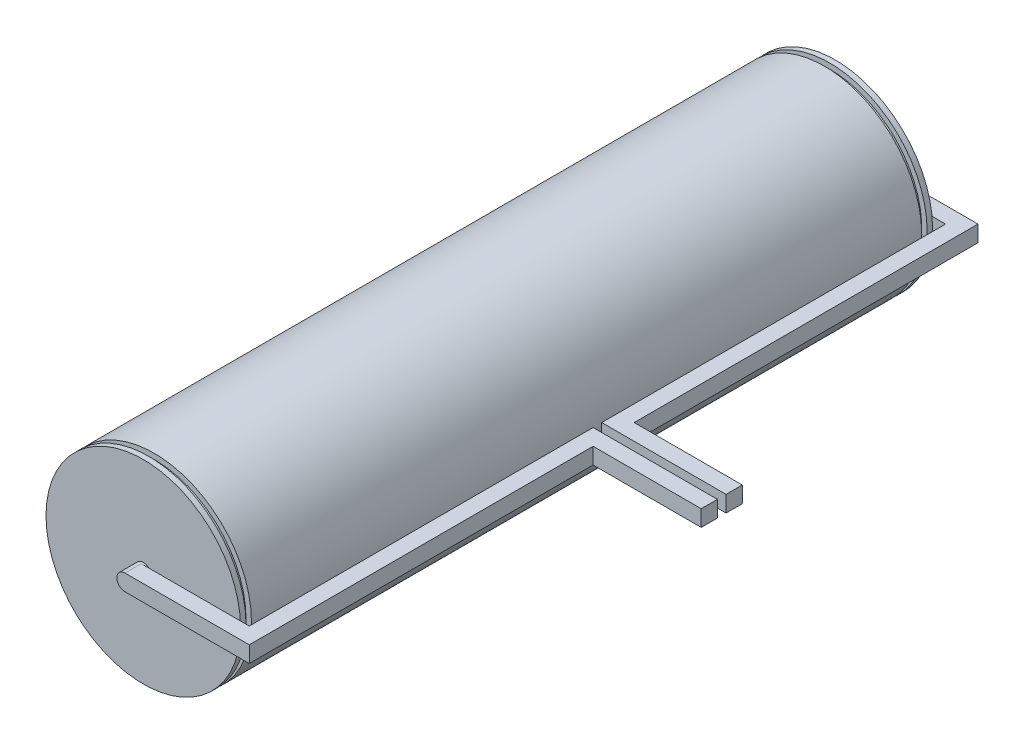
ISO-10303-21;
HEADER;
FILE_DESCRIPTION(('STEP AP214'),'2;1');
FILE_NAME('part.step','',(''),(''),'','','');
FILE_SCHEMA(('AUTOMOTIVE_DESIGN { 1 0 10303 214 1 1 1 1 }'));
ENDSEC;
DATA;
#1=APPLICATION_CONTEXT('core data for automotive mechanical design processes');
#2=APPLICATION_PROTOCOL_DEFINITION('international standard','automotive_design',2000,#1);
#3=PRODUCT_CONTEXT('',#1,'mechanical');
#4=PRODUCT('Part','Part','',(#3));
#5=PRODUCT_RELATED_PRODUCT_CATEGORY('part','',(#4));
#6=PRODUCT_DEFINITION_FORMATION('','',#4);
#7=PRODUCT_DEFINITION_CONTEXT('part definition',#1,'design');
#8=PRODUCT_DEFINITION('design','',#6,#7);
#9=PRODUCT_DEFINITION_SHAPE('','',#8);
#10=(LENGTH_UNIT() NAMED_UNIT(*) SI_UNIT(.MILLI.,.METRE.));
#11=(NAMED_UNIT(*) PLANE_ANGLE_UNIT() SI_UNIT($,.RADIAN.));
#12=(NAMED_UNIT(*) SI_UNIT($,.STERADIAN.) SOLID_ANGLE_UNIT());
#13=UNCERTAINTY_MEASURE_WITH_UNIT(LENGTH_MEASURE(1.E-05),#10,'distance_accuracy_value','');
#14=(GEOMETRIC_REPRESENTATION_CONTEXT(3) GLOBAL_UNCERTAINTY_ASSIGNED_CONTEXT((#13)) GLOBAL_UNIT_ASSIGNED_CONTEXT((#10,
#11,#12)) REPRESENTATION_CONTEXT('',''));
#15=CARTESIAN_POINT('',(0.,0.,0.));
#16=DIRECTION('',(0.,0.,1.));
#17=DIRECTION('',(1.,0.,0.));
#18=AXIS2_PLACEMENT_3D('',#15,#16,#17);
#19=CARTESIAN_POINT('',(11.5,0.,64.7));
#20=DIRECTION('',(-1.,0.,0.));
#21=DIRECTION('',(0.,0.,1.));
#22=AXIS2_PLACEMENT_3D('',#19,#20,#21);
#23=PLANE('',#22);
#24=DIRECTION('',(0.,-1.,0.));
#25=VECTOR('',#24,1.);
#26=CARTESIAN_POINT('',(11.5,0.75,32.9));
#27=LINE('',#26,#25);
#28=CARTESIAN_POINT('',(11.5,0.75,32.9));
#29=VERTEX_POINT('',#28);
#30=CARTESIAN_POINT('',(11.5,-0.75,32.9));
#31=VERTEX_POINT('',#30);
#32=EDGE_CURVE('E52',#29,#31,#27,.T.);
#33=ORIENTED_EDGE('',*,*,#32,.F.);
#34=DIRECTION('',(0.,0.,-1.));
#35=VECTOR('',#34,1.);
#36=CARTESIAN_POINT('',(11.5,0.75,64.7));
#37=LINE('',#36,#35);
#38=CARTESIAN_POINT('',(11.5,0.75,64.7));
#39=VERTEX_POINT('',#38);
#40=EDGE_CURVE('E215',#39,#29,#37,.T.);
#41=ORIENTED_EDGE('',*,*,#40,.F.);
#42=DIRECTION('',(0.,1.,0.));
#43=VECTOR('',#42,1.);
#44=CARTESIAN_POINT('',(11.5,0.,64.7));
#45=LINE('',#44,#43);
#46=CARTESIAN_POINT('',(11.5,-0.75,64.7));
#47=VERTEX_POINT('',#46);
#48=EDGE_CURVE('E199',#47,#39,#45,.T.);
#49=ORIENTED_EDGE('',*,*,#48,.F.);
#50=DIRECTION('',(0.,0.,-1.));
#51=VECTOR('',#50,1.);
#52=CARTESIAN_POINT('',(11.5,-0.75,64.7));
#53=LINE('',#52,#51);
#54=EDGE_CURVE('E217',#47,#31,#53,.T.);
#55=ORIENTED_EDGE('',*,*,#54,.T.);
#56=EDGE_LOOP('',(#33,#41,#49,#55));
#57=FACE_BOUND('',#56,.T.);
#58=ADVANCED_FACE('F35',(#57),#23,.F.);
#59=CARTESIAN_POINT('',(0.,0.,63.2));
#60=DIRECTION('',(0.,0.,1.));
#61=DIRECTION('',(1.,0.,0.));
#62=AXIS2_PLACEMENT_3D('',#59,#60,#61);
#63=PLANE('',#62);
#64=DIRECTION('',(0.,1.,0.));
#65=VECTOR('',#64,1.);
#66=CARTESIAN_POINT('',(10.,0.75,63.2));
#67=LINE('',#66,#65);
#68=CARTESIAN_POINT('',(10.,-0.75,63.2));
#69=VERTEX_POINT('',#68);
#70=CARTESIAN_POINT('',(10.,0.75,63.2));
#71=VERTEX_POINT('',#70);
#72=EDGE_CURVE('E60',#69,#71,#67,.T.);
#73=ORIENTED_EDGE('',*,*,#72,.F.);
#74=DIRECTION('',(1.,0.,0.));
#75=VECTOR('',#74,1.);
#76=CARTESIAN_POINT('',(0.,-0.75,63.2));
#77=LINE('',#76,#75);
#78=CARTESIAN_POINT('',(0.,-0.75,63.2));
#79=VERTEX_POINT('',#78);
#80=EDGE_CURVE('E195',#79,#69,#77,.T.);
#81=ORIENTED_EDGE('',*,*,#80,.F.);
#82=CARTESIAN_POINT('',(0.,0.,63.2));
#83=DIRECTION('',(0.,0.,1.));
#84=DIRECTION('',(1.,0.,0.));
#85=AXIS2_PLACEMENT_3D('',#82,#83,#84);
#86=CIRCLE('',#85,0.75);
#87=CARTESIAN_POINT('',(0.,0.75,63.2));
#88=VERTEX_POINT('',#87);
#89=EDGE_CURVE('E220',#79,#88,#86,.T.);
#90=ORIENTED_EDGE('',*,*,#89,.T.);
#91=DIRECTION('',(1.,0.,0.));
#92=VECTOR('',#91,1.);
#93=CARTESIAN_POINT('',(0.,0.75,63.2));
#94=LINE('',#93,#92);
#95=EDGE_CURVE('E200',#88,#71,#94,.T.);
#96=ORIENTED_EDGE('',*,*,#95,.T.);
#97=EDGE_LOOP('',(#73,#81,#90,#96));
#98=FACE_BOUND('',#97,.T.);
#99=ADVANCED_FACE('F329',(#98),#63,.F.);
#100=CARTESIAN_POINT('',(0.,0.,-1.2));
#101=DIRECTION('',(0.,0.,-1.));
#102=DIRECTION('',(-1.,0.,0.));
#103=AXIS2_PLACEMENT_3D('',#100,#101,#102);
#104=PLANE('',#103);
#105=DIRECTION('',(0.,-1.,0.));
#106=VECTOR('',#105,1.);
#107=CARTESIAN_POINT('',(10.,0.749999999999999,-1.2));
#108=LINE('',#107,#106);
#109=CARTESIAN_POINT('',(10.,0.749999999999999,-1.2));
#110=VERTEX_POINT('',#109);
#111=CARTESIAN_POINT('',(10.,-0.75,-1.2));
#112=VERTEX_POINT('',#111);
#113=EDGE_CURVE('E255',#110,#112,#108,.T.);
#114=ORIENTED_EDGE('',*,*,#113,.F.);
#115=DIRECTION('',(1.,0.,0.));
#116=VECTOR('',#115,1.);
#117=CARTESIAN_POINT('',(0.,0.75,-1.2));
#118=LINE('',#117,#116);
#119=CARTESIAN_POINT('',(0.,0.75,-1.2));
#120=VERTEX_POINT('',#119);
#121=EDGE_CURVE('E273',#120,#110,#118,.T.);
#122=ORIENTED_EDGE('',*,*,#121,.F.);
#123=CARTESIAN_POINT('',(0.,0.,-1.2));
#124=DIRECTION('',(0.,0.,-1.));
#125=DIRECTION('',(-1.,0.,0.));
#126=AXIS2_PLACEMENT_3D('',#123,#124,#125);
#127=CIRCLE('',#126,0.75);
#128=CARTESIAN_POINT('',(0.,-0.75,-1.2));
#129=VERTEX_POINT('',#128);
#130=EDGE_CURVE('E296',#120,#129,#127,.T.);
#131=ORIENTED_EDGE('',*,*,#130,.T.);
#132=DIRECTION('',(1.,0.,0.));
#133=VECTOR('',#132,1.);
#134=CARTESIAN_POINT('',(0.,-0.75,-1.2));
#135=LINE('',#134,#133);
#136=EDGE_CURVE('E268',#129,#112,#135,.T.);
#137=ORIENTED_EDGE('',*,*,#136,.T.);
#138=EDGE_LOOP('',(#114,#122,#131,#137));
#139=FACE_BOUND('',#138,.T.);
#140=ADVANCED_FACE('F327',(#139),#104,.F.);
#141=CARTESIAN_POINT('',(0.,0.,31.));
#142=DIRECTION('',(0.,0.,-1.));
#143=DIRECTION('',(-1.,0.,0.));
#144=AXIS2_PLACEMENT_3D('',#141,#142,#143);
#145=CYLINDRICAL_SURFACE('',#144,9.);
#146=CARTESIAN_POINT('',(0.,0.,0.));
#147=DIRECTION('',(0.,0.,1.));
#148=DIRECTION('',(1.,0.,0.));
#149=AXIS2_PLACEMENT_3D('',#146,#147,#148);
#150=CIRCLE('',#149,9.);
#151=CARTESIAN_POINT('',(9.,0.,0.));
#152=VERTEX_POINT('',#151);
#153=EDGE_CURVE('E39',#152,#152,#150,.T.);
#154=ORIENTED_EDGE('',*,*,#153,.T.);
#155=EDGE_LOOP('',(#154));
#156=FACE_BOUND('',#155,.T.);
#157=CARTESIAN_POINT('',(0.,0.,62.));
#158=DIRECTION('',(0.,0.,1.));
#159=DIRECTION('',(1.,0.,0.));
#160=AXIS2_PLACEMENT_3D('',#157,#158,#159);
#161=CIRCLE('',#160,9.);
#162=CARTESIAN_POINT('',(9.,0.,62.));
#163=VERTEX_POINT('',#162);
#164=EDGE_CURVE('E232',#163,#163,#161,.T.);
#165=ORIENTED_EDGE('',*,*,#164,.F.);
#166=EDGE_LOOP('',(#165));
#167=FACE_BOUND('',#166,.T.);
#168=ADVANCED_FACE('F37',(#156,#167),#145,.T.);
#169=CARTESIAN_POINT('',(0.,0.,0.));
#170=DIRECTION('',(0.,0.,1.));
#171=DIRECTION('',(1.,0.,0.));
#172=AXIS2_PLACEMENT_3D('',#169,#170,#171);
#173=PLANE('',#172);
#174=CARTESIAN_POINT('',(0.,0.,0.));
#175=DIRECTION('',(0.,0.,-1.));
#176=DIRECTION('',(-1.,0.,0.));
#177=AXIS2_PLACEMENT_3D('',#174,#175,#176);
#178=CIRCLE('',#177,8.5);
#179=CARTESIAN_POINT('',(-8.5,0.,0.));
#180=VERTEX_POINT('',#179);
#181=EDGE_CURVE('E44',#180,#180,#178,.T.);
#182=ORIENTED_EDGE('',*,*,#181,.F.);
#183=EDGE_LOOP('',(#182));
#184=FACE_BOUND('',#183,.T.);
#185=ORIENTED_EDGE('',*,*,#153,.F.);
#186=EDGE_LOOP('',(#185));
#187=FACE_BOUND('',#186,.T.);
#188=ADVANCED_FACE('F316',(#184,#187),#173,.F.);
#189=CARTESIAN_POINT('',(0.,0.,-0.5));
#190=DIRECTION('',(0.,0.,1.));
#191=DIRECTION('',(1.,0.,0.));
#192=AXIS2_PLACEMENT_3D('',#189,#190,#191);
#193=CYLINDRICAL_SURFACE('',#192,8.5);
#194=CARTESIAN_POINT('',(0.,0.,-0.5));
#195=DIRECTION('',(0.,0.,-1.));
#196=DIRECTION('',(-1.,0.,0.));
#197=AXIS2_PLACEMENT_3D('',#194,#195,#196);
#198=CIRCLE('',#197,8.5);
#199=CARTESIAN_POINT('',(-8.5,0.,-0.5));
#200=VERTEX_POINT('',#199);
#201=EDGE_CURVE('E304',#200,#200,#198,.T.);
#202=ORIENTED_EDGE('',*,*,#201,.F.);
#203=EDGE_LOOP('',(#202));
#204=FACE_BOUND('',#203,.T.);
#205=ORIENTED_EDGE('',*,*,#181,.T.);
#206=EDGE_LOOP('',(#205));
#207=FACE_BOUND('',#206,.T.);
#208=ADVANCED_FACE('F318',(#204,#207),#193,.T.);
#209=CARTESIAN_POINT('',(0.,0.,-1.));
#210=DIRECTION('',(0.,0.,1.));
#211=DIRECTION('',(1.,0.,0.));
#212=AXIS2_PLACEMENT_3D('',#209,#210,#211);
#213=CYLINDRICAL_SURFACE('',#212,9.);
#214=CARTESIAN_POINT('',(0.,0.,-1.));
#215=DIRECTION('',(0.,0.,-1.));
#216=DIRECTION('',(-1.,0.,0.));
#217=AXIS2_PLACEMENT_3D('',#214,#215,#216);
#218=CIRCLE('',#217,9.);
#219=CARTESIAN_POINT('',(-9.,0.,-1.));
#220=VERTEX_POINT('',#219);
#221=EDGE_CURVE('E301',#220,#220,#218,.T.);
#222=ORIENTED_EDGE('',*,*,#221,.F.);
#223=EDGE_LOOP('',(#222));
#224=FACE_BOUND('',#223,.T.);
#225=CARTESIAN_POINT('',(0.,0.,-0.5));
#226=DIRECTION('',(0.,0.,-1.));
#227=DIRECTION('',(-1.,0.,0.));
#228=AXIS2_PLACEMENT_3D('',#225,#226,#227);
#229=CIRCLE('',#228,9.);
#230=CARTESIAN_POINT('',(-9.,0.,-0.5));
#231=VERTEX_POINT('',#230);
#232=EDGE_CURVE('E298',#231,#231,#229,.T.);
#233=ORIENTED_EDGE('',*,*,#232,.T.);
#234=EDGE_LOOP('',(#233));
#235=FACE_BOUND('',#234,.T.);
#236=ADVANCED_FACE('F324',(#224,#235),#213,.T.);
#237=CARTESIAN_POINT('',(0.,0.,-1.));
#238=DIRECTION('',(0.,0.,-1.));
#239=DIRECTION('',(-1.,0.,0.));
#240=AXIS2_PLACEMENT_3D('',#237,#238,#239);
#241=PLANE('',#240);
#242=CARTESIAN_POINT('',(0.,0.,-1.));
#243=DIRECTION('',(0.,0.,-1.));
#244=DIRECTION('',(-1.,0.,0.));
#245=AXIS2_PLACEMENT_3D('',#242,#243,#244);
#246=CIRCLE('',#245,0.75);
#247=CARTESIAN_POINT('',(-0.75,0.,-1.));
#248=VERTEX_POINT('',#247);
#249=EDGE_CURVE('E295',#248,#248,#246,.T.);
#250=ORIENTED_EDGE('',*,*,#249,.F.);
#251=EDGE_LOOP('',(#250));
#252=FACE_BOUND('',#251,.T.);
#253=ORIENTED_EDGE('',*,*,#221,.T.);
#254=EDGE_LOOP('',(#253));
#255=FACE_BOUND('',#254,.T.);
#256=ADVANCED_FACE('F405',(#252,#255),#241,.T.);
#257=CARTESIAN_POINT('',(0.,0.,-0.5));
#258=DIRECTION('',(0.,0.,-1.));
#259=DIRECTION('',(-1.,0.,0.));
#260=AXIS2_PLACEMENT_3D('',#257,#258,#259);
#261=PLANE('',#260);
#262=ORIENTED_EDGE('',*,*,#201,.T.);
#263=EDGE_LOOP('',(#262));
#264=FACE_BOUND('',#263,.T.);
#265=ORIENTED_EDGE('',*,*,#232,.F.);
#266=EDGE_LOOP('',(#265));
#267=FACE_BOUND('',#266,.T.);
#268=ADVANCED_FACE('F403',(#264,#267),#261,.F.);
#269=CARTESIAN_POINT('',(0.,0.,-1.2));
#270=DIRECTION('',(0.,0.,1.));
#271=DIRECTION('',(1.,0.,0.));
#272=AXIS2_PLACEMENT_3D('',#269,#270,#271);
#273=CYLINDRICAL_SURFACE('',#272,0.75);
#274=ORIENTED_EDGE('',*,*,#130,.F.);
#275=DIRECTION('',(0.,0.,1.));
#276=VECTOR('',#275,1.);
#277=CARTESIAN_POINT('',(0.,0.75,-2.7));
#278=LINE('',#277,#276);
#279=CARTESIAN_POINT('',(0.,0.75,-2.7));
#280=VERTEX_POINT('',#279);
#281=EDGE_CURVE('E286',#280,#120,#278,.T.);
#282=ORIENTED_EDGE('',*,*,#281,.F.);
#283=CARTESIAN_POINT('',(0.,0.,-2.7));
#284=DIRECTION('',(0.,0.,-1.));
#285=DIRECTION('',(-1.,0.,0.));
#286=AXIS2_PLACEMENT_3D('',#283,#284,#285);
#287=CIRCLE('',#286,0.75);
#288=CARTESIAN_POINT('',(0.,-0.75,-2.7));
#289=VERTEX_POINT('',#288);
#290=EDGE_CURVE('E276',#289,#280,#287,.T.);
#291=ORIENTED_EDGE('',*,*,#290,.F.);
#292=DIRECTION('',(0.,0.,1.));
#293=VECTOR('',#292,1.);
#294=CARTESIAN_POINT('',(0.,-0.75,-2.7));
#295=LINE('',#294,#293);
#296=EDGE_CURVE('E289',#289,#129,#295,.T.);
#297=ORIENTED_EDGE('',*,*,#296,.T.);
#298=EDGE_LOOP('',(#274,#282,#291,#297));
#299=FACE_BOUND('',#298,.T.);
#300=ORIENTED_EDGE('',*,*,#249,.T.);
#301=EDGE_LOOP('',(#300));
#302=FACE_BOUND('',#301,.T.);
#303=ADVANCED_FACE('F399',(#299,#302),#273,.T.);
#304=CARTESIAN_POINT('',(11.5,0.,-2.7));
#305=DIRECTION('',(1.,0.,0.));
#306=DIRECTION('',(0.,0.,-1.));
#307=AXIS2_PLACEMENT_3D('',#304,#305,#306);
#308=PLANE('',#307);
#309=DIRECTION('',(0.,1.,0.));
#310=VECTOR('',#309,1.);
#311=CARTESIAN_POINT('',(11.5,0.749999999999999,29.1));
#312=LINE('',#311,#310);
#313=CARTESIAN_POINT('',(11.5,-0.750000000000002,29.1));
#314=VERTEX_POINT('',#313);
#315=CARTESIAN_POINT('',(11.5,0.749999999999999,29.1));
#316=VERTEX_POINT('',#315);
#317=EDGE_CURVE('E236',#314,#316,#312,.T.);
#318=ORIENTED_EDGE('',*,*,#317,.F.);
#319=DIRECTION('',(0.,0.,1.));
#320=VECTOR('',#319,1.);
#321=CARTESIAN_POINT('',(11.5,-0.750000000000002,-2.7));
#322=LINE('',#321,#320);
#323=CARTESIAN_POINT('',(11.5,-0.750000000000002,-2.7));
#324=VERTEX_POINT('',#323);
#325=EDGE_CURVE('E292',#324,#314,#322,.T.);
#326=ORIENTED_EDGE('',*,*,#325,.F.);
#327=DIRECTION('',(0.,1.,0.));
#328=VECTOR('',#327,1.);
#329=CARTESIAN_POINT('',(11.5,0.,-2.7));
#330=LINE('',#329,#328);
#331=CARTESIAN_POINT('',(11.5,0.749999999999999,-2.7));
#332=VERTEX_POINT('',#331);
#333=EDGE_CURVE('E269',#324,#332,#330,.T.);
#334=ORIENTED_EDGE('',*,*,#333,.T.);
#335=DIRECTION('',(0.,0.,1.));
#336=VECTOR('',#335,1.);
#337=CARTESIAN_POINT('',(11.5,0.749999999999999,-2.7));
#338=LINE('',#337,#336);
#339=EDGE_CURVE('E280',#332,#316,#338,.T.);
#340=ORIENTED_EDGE('',*,*,#339,.T.);
#341=EDGE_LOOP('',(#318,#326,#334,#340));
#342=FACE_BOUND('',#341,.T.);
#343=ADVANCED_FACE('F395',(#342),#308,.T.);
#344=CARTESIAN_POINT('',(0.,-0.75,-2.7));
#345=DIRECTION('',(0.,-1.,0.));
#346=DIRECTION('',(1.,0.,0.));
#347=AXIS2_PLACEMENT_3D('',#344,#345,#346);
#348=PLANE('',#347);
#349=ORIENTED_EDGE('',*,*,#136,.F.);
#350=ORIENTED_EDGE('',*,*,#296,.F.);
#351=DIRECTION('',(1.,0.,0.));
#352=VECTOR('',#351,1.);
#353=CARTESIAN_POINT('',(0.,-0.75,-2.7));
#354=LINE('',#353,#352);
#355=EDGE_CURVE('E272',#289,#324,#354,.T.);
#356=ORIENTED_EDGE('',*,*,#355,.T.);
#357=ORIENTED_EDGE('',*,*,#325,.T.);
#358=DIRECTION('',(-1.,0.,0.));
#359=VECTOR('',#358,1.);
#360=CARTESIAN_POINT('',(21.5,-0.750000000000002,29.1));
#361=LINE('',#360,#359);
#362=CARTESIAN_POINT('',(21.5,-0.750000000000002,29.1));
#363=VERTEX_POINT('',#362);
#364=EDGE_CURVE('E252',#363,#314,#361,.T.);
#365=ORIENTED_EDGE('',*,*,#364,.F.);
#366=DIRECTION('',(0.,0.,-1.));
#367=VECTOR('',#366,1.);
#368=CARTESIAN_POINT('',(21.5,-0.750000000000001,30.6));
#369=LINE('',#368,#367);
#370=CARTESIAN_POINT('',(21.5,-0.750000000000001,30.6));
#371=VERTEX_POINT('',#370);
#372=EDGE_CURVE('E240',#371,#363,#369,.T.);
#373=ORIENTED_EDGE('',*,*,#372,.F.);
#374=DIRECTION('',(1.,0.,0.));
#375=VECTOR('',#374,1.);
#376=CARTESIAN_POINT('',(11.5,-0.750000000000001,30.6));
#377=LINE('',#376,#375);
#378=CARTESIAN_POINT('',(10.,-0.75,30.6));
#379=VERTEX_POINT('',#378);
#380=EDGE_CURVE('E260',#379,#371,#377,.T.);
#381=ORIENTED_EDGE('',*,*,#380,.F.);
#382=DIRECTION('',(0.,0.,-1.));
#383=VECTOR('',#382,1.);
#384=CARTESIAN_POINT('',(10.,-0.75,30.6));
#385=LINE('',#384,#383);
#386=EDGE_CURVE('E262',#379,#112,#385,.T.);
#387=ORIENTED_EDGE('',*,*,#386,.T.);
#388=EDGE_LOOP('',(#349,#350,#356,#357,#365,#373,#381,#387));
#389=FACE_BOUND('',#388,.T.);
#390=ADVANCED_FACE('F391',(#389),#348,.T.);
#391=CARTESIAN_POINT('',(0.,0.75,-2.7));
#392=DIRECTION('',(0.,-1.,0.));
#393=DIRECTION('',(1.,0.,0.));
#394=AXIS2_PLACEMENT_3D('',#391,#392,#393);
#395=PLANE('',#394);
#396=ORIENTED_EDGE('',*,*,#121,.T.);
#397=DIRECTION('',(0.,0.,-1.));
#398=VECTOR('',#397,1.);
#399=CARTESIAN_POINT('',(10.,0.749999999999999,30.6));
#400=LINE('',#399,#398);
#401=CARTESIAN_POINT('',(10.,0.749999999999999,30.6));
#402=VERTEX_POINT('',#401);
#403=EDGE_CURVE('E266',#402,#110,#400,.T.);
#404=ORIENTED_EDGE('',*,*,#403,.F.);
#405=DIRECTION('',(-1.,0.,0.));
#406=VECTOR('',#405,1.);
#407=CARTESIAN_POINT('',(11.5,0.749999999999999,30.6));
#408=LINE('',#407,#406);
#409=CARTESIAN_POINT('',(21.5,0.749999999999999,30.6));
#410=VERTEX_POINT('',#409);
#411=EDGE_CURVE('E256',#410,#402,#408,.T.);
#412=ORIENTED_EDGE('',*,*,#411,.F.);
#413=DIRECTION('',(0.,0.,1.));
#414=VECTOR('',#413,1.);
#415=CARTESIAN_POINT('',(21.5,0.749999999999999,30.6));
#416=LINE('',#415,#414);
#417=CARTESIAN_POINT('',(21.5,0.749999999999999,29.1));
#418=VERTEX_POINT('',#417);
#419=EDGE_CURVE('E244',#418,#410,#416,.T.);
#420=ORIENTED_EDGE('',*,*,#419,.F.);
#421=DIRECTION('',(-1.,0.,0.));
#422=VECTOR('',#421,1.);
#423=CARTESIAN_POINT('',(21.5,0.749999999999999,29.1));
#424=LINE('',#423,#422);
#425=EDGE_CURVE('E247',#418,#316,#424,.T.);
#426=ORIENTED_EDGE('',*,*,#425,.T.);
#427=ORIENTED_EDGE('',*,*,#339,.F.);
#428=DIRECTION('',(1.,0.,0.));
#429=VECTOR('',#428,1.);
#430=CARTESIAN_POINT('',(0.,0.75,-2.7));
#431=LINE('',#430,#429);
#432=EDGE_CURVE('E278',#280,#332,#431,.T.);
#433=ORIENTED_EDGE('',*,*,#432,.F.);
#434=ORIENTED_EDGE('',*,*,#281,.T.);
#435=EDGE_LOOP('',(#396,#404,#412,#420,#426,#427,#433,#434));
#436=FACE_BOUND('',#435,.T.);
#437=ADVANCED_FACE('F384',(#436),#395,.F.);
#438=CARTESIAN_POINT('',(0.,0.,-2.7));
#439=DIRECTION('',(0.,0.,-1.));
#440=DIRECTION('',(-1.,0.,0.));
#441=AXIS2_PLACEMENT_3D('',#438,#439,#440);
#442=PLANE('',#441);
#443=ORIENTED_EDGE('',*,*,#333,.F.);
#444=ORIENTED_EDGE('',*,*,#355,.F.);
#445=ORIENTED_EDGE('',*,*,#290,.T.);
#446=ORIENTED_EDGE('',*,*,#432,.T.);
#447=EDGE_LOOP('',(#443,#444,#445,#446));
#448=FACE_BOUND('',#447,.T.);
#449=ADVANCED_FACE('F380',(#448),#442,.T.);
#450=CARTESIAN_POINT('',(10.,0.749999999999999,30.6));
#451=DIRECTION('',(1.,0.,0.));
#452=DIRECTION('',(0.,0.,-1.));
#453=AXIS2_PLACEMENT_3D('',#450,#451,#452);
#454=PLANE('',#453);
#455=ORIENTED_EDGE('',*,*,#113,.T.);
#456=ORIENTED_EDGE('',*,*,#386,.F.);
#457=DIRECTION('',(0.,-1.,0.));
#458=VECTOR('',#457,1.);
#459=CARTESIAN_POINT('',(10.,0.749999999999999,30.6));
#460=LINE('',#459,#458);
#461=EDGE_CURVE('E258',#402,#379,#460,.T.);
#462=ORIENTED_EDGE('',*,*,#461,.F.);
#463=ORIENTED_EDGE('',*,*,#403,.T.);
#464=EDGE_LOOP('',(#455,#456,#462,#463));
#465=FACE_BOUND('',#464,.T.);
#466=ADVANCED_FACE('F376',(#465),#454,.F.);
#467=CARTESIAN_POINT('',(0.,0.,30.6));
#468=DIRECTION('',(0.,0.,-1.));
#469=DIRECTION('',(-1.,0.,0.));
#470=AXIS2_PLACEMENT_3D('',#467,#468,#469);
#471=PLANE('',#470);
#472=ORIENTED_EDGE('',*,*,#380,.T.);
#473=DIRECTION('',(0.,-1.,0.));
#474=VECTOR('',#473,1.);
#475=CARTESIAN_POINT('',(21.5,0.749999999999999,30.6));
#476=LINE('',#475,#474);
#477=EDGE_CURVE('E237',#410,#371,#476,.T.);
#478=ORIENTED_EDGE('',*,*,#477,.F.);
#479=ORIENTED_EDGE('',*,*,#411,.T.);
#480=ORIENTED_EDGE('',*,*,#461,.T.);
#481=EDGE_LOOP('',(#472,#478,#479,#480));
#482=FACE_BOUND('',#481,.T.);
#483=ADVANCED_FACE('F372',(#482),#471,.F.);
#484=CARTESIAN_POINT('',(21.5,0.749999999999999,29.1));
#485=DIRECTION('',(0.,0.,1.));
#486=DIRECTION('',(1.,0.,0.));
#487=AXIS2_PLACEMENT_3D('',#484,#485,#486);
#488=PLANE('',#487);
#489=ORIENTED_EDGE('',*,*,#317,.T.);
#490=ORIENTED_EDGE('',*,*,#425,.F.);
#491=DIRECTION('',(0.,1.,0.));
#492=VECTOR('',#491,1.);
#493=CARTESIAN_POINT('',(21.5,0.749999999999999,29.1));
#494=LINE('',#493,#492);
#495=EDGE_CURVE('E242',#363,#418,#494,.T.);
#496=ORIENTED_EDGE('',*,*,#495,.F.);
#497=ORIENTED_EDGE('',*,*,#364,.T.);
#498=EDGE_LOOP('',(#489,#490,#496,#497));
#499=FACE_BOUND('',#498,.T.);
#500=ADVANCED_FACE('F368',(#499),#488,.F.);
#501=CARTESIAN_POINT('',(21.5,0.,0.));
#502=DIRECTION('',(1.,0.,0.));
#503=DIRECTION('',(0.,0.,-1.));
#504=AXIS2_PLACEMENT_3D('',#501,#502,#503);
#505=PLANE('',#504);
#506=ORIENTED_EDGE('',*,*,#477,.T.);
#507=ORIENTED_EDGE('',*,*,#372,.T.);
#508=ORIENTED_EDGE('',*,*,#495,.T.);
#509=ORIENTED_EDGE('',*,*,#419,.T.);
#510=EDGE_LOOP('',(#506,#507,#508,#509));
#511=FACE_BOUND('',#510,.T.);
#512=ADVANCED_FACE('F364',(#511),#505,.T.);
#513=CARTESIAN_POINT('',(0.,0.,62.));
#514=DIRECTION('',(0.,0.,1.));
#515=DIRECTION('',(1.,0.,0.));
#516=AXIS2_PLACEMENT_3D('',#513,#514,#515);
#517=PLANE('',#516);
#518=CARTESIAN_POINT('',(0.,0.,62.));
#519=DIRECTION('',(0.,0.,1.));
#520=DIRECTION('',(1.,0.,0.));
#521=AXIS2_PLACEMENT_3D('',#518,#519,#520);
#522=CIRCLE('',#521,8.5);
#523=CARTESIAN_POINT('',(8.5,0.,62.));
#524=VERTEX_POINT('',#523);
#525=EDGE_CURVE('E11',#524,#524,#522,.T.);
#526=ORIENTED_EDGE('',*,*,#525,.F.);
#527=EDGE_LOOP('',(#526));
#528=FACE_BOUND('',#527,.T.);
#529=ORIENTED_EDGE('',*,*,#164,.T.);
#530=EDGE_LOOP('',(#529));
#531=FACE_BOUND('',#530,.T.);
#532=ADVANCED_FACE('F360',(#528,#531),#517,.T.);
#533=CARTESIAN_POINT('',(0.,0.,62.5));
#534=DIRECTION('',(0.,0.,-1.));
#535=DIRECTION('',(-1.,0.,0.));
#536=AXIS2_PLACEMENT_3D('',#533,#534,#535);
#537=CYLINDRICAL_SURFACE('',#536,8.5);
#538=CARTESIAN_POINT('',(0.,0.,62.5));
#539=DIRECTION('',(0.,0.,1.));
#540=DIRECTION('',(1.,0.,0.));
#541=AXIS2_PLACEMENT_3D('',#538,#539,#540);
#542=CIRCLE('',#541,8.5);
#543=CARTESIAN_POINT('',(8.5,0.,62.5));
#544=VERTEX_POINT('',#543);
#545=EDGE_CURVE('E228',#544,#544,#542,.T.);
#546=ORIENTED_EDGE('',*,*,#545,.F.);
#547=EDGE_LOOP('',(#546));
#548=FACE_BOUND('',#547,.T.);
#549=ORIENTED_EDGE('',*,*,#525,.T.);
#550=EDGE_LOOP('',(#549));
#551=FACE_BOUND('',#550,.T.);
#552=ADVANCED_FACE('F356',(#548,#551),#537,.T.);
#553=CARTESIAN_POINT('',(0.,0.,63.));
#554=DIRECTION('',(0.,0.,-1.));
#555=DIRECTION('',(-1.,0.,0.));
#556=AXIS2_PLACEMENT_3D('',#553,#554,#555);
#557=CYLINDRICAL_SURFACE('',#556,9.);
#558=CARTESIAN_POINT('',(0.,0.,63.));
#559=DIRECTION('',(0.,0.,1.));
#560=DIRECTION('',(1.,0.,0.));
#561=AXIS2_PLACEMENT_3D('',#558,#559,#560);
#562=CIRCLE('',#561,9.);
#563=CARTESIAN_POINT('',(9.,0.,63.));
#564=VERTEX_POINT('',#563);
#565=EDGE_CURVE('E225',#564,#564,#562,.T.);
#566=ORIENTED_EDGE('',*,*,#565,.F.);
#567=EDGE_LOOP('',(#566));
#568=FACE_BOUND('',#567,.T.);
#569=CARTESIAN_POINT('',(0.,0.,62.5));
#570=DIRECTION('',(0.,0.,1.));
#571=DIRECTION('',(1.,0.,0.));
#572=AXIS2_PLACEMENT_3D('',#569,#570,#571);
#573=CIRCLE('',#572,9.);
#574=CARTESIAN_POINT('',(9.,0.,62.5));
#575=VERTEX_POINT('',#574);
#576=EDGE_CURVE('E222',#575,#575,#573,.T.);
#577=ORIENTED_EDGE('',*,*,#576,.T.);
#578=EDGE_LOOP('',(#577));
#579=FACE_BOUND('',#578,.T.);
#580=ADVANCED_FACE('F349',(#568,#579),#557,.T.);
#581=CARTESIAN_POINT('',(0.,0.,63.));
#582=DIRECTION('',(0.,0.,1.));
#583=DIRECTION('',(1.,0.,0.));
#584=AXIS2_PLACEMENT_3D('',#581,#582,#583);
#585=PLANE('',#584);
#586=CARTESIAN_POINT('',(0.,0.,63.));
#587=DIRECTION('',(0.,0.,1.));
#588=DIRECTION('',(1.,0.,0.));
#589=AXIS2_PLACEMENT_3D('',#586,#587,#588);
#590=CIRCLE('',#589,0.75);
#591=CARTESIAN_POINT('',(0.75,0.,63.));
#592=VERTEX_POINT('',#591);
#593=EDGE_CURVE('E219',#592,#592,#590,.T.);
#594=ORIENTED_EDGE('',*,*,#593,.F.);
#595=EDGE_LOOP('',(#594));
#596=FACE_BOUND('',#595,.T.);
#597=ORIENTED_EDGE('',*,*,#565,.T.);
#598=EDGE_LOOP('',(#597));
#599=FACE_BOUND('',#598,.T.);
#600=ADVANCED_FACE('F346',(#596,#599),#585,.T.);
#601=CARTESIAN_POINT('',(0.,0.,62.5));
#602=DIRECTION('',(0.,0.,1.));
#603=DIRECTION('',(1.,0.,0.));
#604=AXIS2_PLACEMENT_3D('',#601,#602,#603);
#605=PLANE('',#604);
#606=ORIENTED_EDGE('',*,*,#545,.T.);
#607=EDGE_LOOP('',(#606));
#608=FACE_BOUND('',#607,.T.);
#609=ORIENTED_EDGE('',*,*,#576,.F.);
#610=EDGE_LOOP('',(#609));
#611=FACE_BOUND('',#610,.T.);
#612=ADVANCED_FACE('F344',(#608,#611),#605,.F.);
#613=CARTESIAN_POINT('',(0.,0.,63.2));
#614=DIRECTION('',(0.,0.,-1.));
#615=DIRECTION('',(-1.,0.,0.));
#616=AXIS2_PLACEMENT_3D('',#613,#614,#615);
#617=CYLINDRICAL_SURFACE('',#616,0.75);
#618=ORIENTED_EDGE('',*,*,#89,.F.);
#619=DIRECTION('',(0.,0.,-1.));
#620=VECTOR('',#619,1.);
#621=CARTESIAN_POINT('',(0.,-0.75,64.7));
#622=LINE('',#621,#620);
#623=CARTESIAN_POINT('',(0.,-0.75,64.7));
#624=VERTEX_POINT('',#623);
#625=EDGE_CURVE('E207',#624,#79,#622,.T.);
#626=ORIENTED_EDGE('',*,*,#625,.F.);
#627=CARTESIAN_POINT('',(0.,0.,64.7));
#628=DIRECTION('',(0.,0.,1.));
#629=DIRECTION('',(1.,0.,0.));
#630=AXIS2_PLACEMENT_3D('',#627,#628,#629);
#631=CIRCLE('',#630,0.75);
#632=CARTESIAN_POINT('',(0.,0.75,64.7));
#633=VERTEX_POINT('',#632);
#634=EDGE_CURVE('E205',#633,#624,#631,.T.);
#635=ORIENTED_EDGE('',*,*,#634,.F.);
#636=DIRECTION('',(0.,0.,-1.));
#637=VECTOR('',#636,1.);
#638=CARTESIAN_POINT('',(0.,0.75,64.7));
#639=LINE('',#638,#637);
#640=EDGE_CURVE('E212',#633,#88,#639,.T.);
#641=ORIENTED_EDGE('',*,*,#640,.T.);
#642=EDGE_LOOP('',(#618,#626,#635,#641));
#643=FACE_BOUND('',#642,.T.);
#644=ORIENTED_EDGE('',*,*,#593,.T.);
#645=EDGE_LOOP('',(#644));
#646=FACE_BOUND('',#645,.T.);
#647=ADVANCED_FACE('F340',(#643,#646),#617,.T.);
#648=CARTESIAN_POINT('',(0.,-0.75,64.7));
#649=DIRECTION('',(0.,1.,0.));
#650=DIRECTION('',(0.,0.,1.));
#651=AXIS2_PLACEMENT_3D('',#648,#649,#650);
#652=PLANE('',#651);
#653=ORIENTED_EDGE('',*,*,#80,.T.);
#654=DIRECTION('',(0.,0.,1.));
#655=VECTOR('',#654,1.);
#656=CARTESIAN_POINT('',(10.,-0.75,31.4));
#657=LINE('',#656,#655);
#658=CARTESIAN_POINT('',(10.,-0.75,31.4));
#659=VERTEX_POINT('',#658);
#660=EDGE_CURVE('E192',#659,#69,#657,.T.);
#661=ORIENTED_EDGE('',*,*,#660,.F.);
#662=DIRECTION('',(-1.,0.,0.));
#663=VECTOR('',#662,1.);
#664=CARTESIAN_POINT('',(11.5,-0.75,31.4));
#665=LINE('',#664,#663);
#666=CARTESIAN_POINT('',(21.5,-0.75,31.4));
#667=VERTEX_POINT('',#666);
#668=EDGE_CURVE('E187',#667,#659,#665,.T.);
#669=ORIENTED_EDGE('',*,*,#668,.F.);
#670=DIRECTION('',(0.,0.,-1.));
#671=VECTOR('',#670,1.);
#672=CARTESIAN_POINT('',(21.5,-0.75,31.4));
#673=LINE('',#672,#671);
#674=CARTESIAN_POINT('',(21.5,-0.75,32.9));
#675=VERTEX_POINT('',#674);
#676=EDGE_CURVE('E177',#675,#667,#673,.T.);
#677=ORIENTED_EDGE('',*,*,#676,.F.);
#678=DIRECTION('',(-1.,0.,0.));
#679=VECTOR('',#678,1.);
#680=CARTESIAN_POINT('',(21.5,-0.75,32.9));
#681=LINE('',#680,#679);
#682=EDGE_CURVE('E182',#675,#31,#681,.T.);
#683=ORIENTED_EDGE('',*,*,#682,.T.);
#684=ORIENTED_EDGE('',*,*,#54,.F.);
#685=DIRECTION('',(1.,0.,0.));
#686=VECTOR('',#685,1.);
#687=CARTESIAN_POINT('',(0.,-0.75,64.7));
#688=LINE('',#687,#686);
#689=EDGE_CURVE('E196',#624,#47,#688,.T.);
#690=ORIENTED_EDGE('',*,*,#689,.F.);
#691=ORIENTED_EDGE('',*,*,#625,.T.);
#692=EDGE_LOOP('',(#653,#661,#669,#677,#683,#684,#690,#691));
#693=FACE_BOUND('',#692,.T.);
#694=ADVANCED_FACE('F337',(#693),#652,.F.);
#695=CARTESIAN_POINT('',(0.,0.75,64.7));
#696=DIRECTION('',(0.,1.,0.));
#697=DIRECTION('',(0.,0.,1.));
#698=AXIS2_PLACEMENT_3D('',#695,#696,#697);
#699=PLANE('',#698);
#700=ORIENTED_EDGE('',*,*,#95,.F.);
#701=ORIENTED_EDGE('',*,*,#640,.F.);
#702=DIRECTION('',(1.,0.,0.));
#703=VECTOR('',#702,1.);
#704=CARTESIAN_POINT('',(0.,0.75,64.7));
#705=LINE('',#704,#703);
#706=EDGE_CURVE('E202',#633,#39,#705,.T.);
#707=ORIENTED_EDGE('',*,*,#706,.T.);
#708=ORIENTED_EDGE('',*,*,#40,.T.);
#709=DIRECTION('',(-1.,0.,0.));
#710=VECTOR('',#709,1.);
#711=CARTESIAN_POINT('',(21.5,0.75,32.9));
#712=LINE('',#711,#710);
#713=CARTESIAN_POINT('',(21.5,0.75,32.9));
#714=VERTEX_POINT('',#713);
#715=EDGE_CURVE('E169',#714,#29,#712,.T.);
#716=ORIENTED_EDGE('',*,*,#715,.F.);
#717=DIRECTION('',(0.,0.,1.));
#718=VECTOR('',#717,1.);
#719=CARTESIAN_POINT('',(21.5,0.75,31.4));
#720=LINE('',#719,#718);
#721=CARTESIAN_POINT('',(21.5,0.75,31.4));
#722=VERTEX_POINT('',#721);
#723=EDGE_CURVE('E165',#722,#714,#720,.T.);
#724=ORIENTED_EDGE('',*,*,#723,.F.);
#725=DIRECTION('',(1.,0.,0.));
#726=VECTOR('',#725,1.);
#727=CARTESIAN_POINT('',(11.5,0.75,31.4));
#728=LINE('',#727,#726);
#729=CARTESIAN_POINT('',(10.,0.75,31.4));
#730=VERTEX_POINT('',#729);
#731=EDGE_CURVE('E152',#730,#722,#728,.T.);
#732=ORIENTED_EDGE('',*,*,#731,.F.);
#733=DIRECTION('',(0.,0.,1.));
#734=VECTOR('',#733,1.);
#735=CARTESIAN_POINT('',(10.,0.75,31.4));
#736=LINE('',#735,#734);
#737=EDGE_CURVE('E162',#730,#71,#736,.T.);
#738=ORIENTED_EDGE('',*,*,#737,.T.);
#739=EDGE_LOOP('',(#700,#701,#707,#708,#716,#724,#732,#738));
#740=FACE_BOUND('',#739,.T.);
#741=ADVANCED_FACE('F167',(#740),#699,.T.);
#742=CARTESIAN_POINT('',(0.,0.,64.7));
#743=DIRECTION('',(0.,0.,1.));
#744=DIRECTION('',(1.,0.,0.));
#745=AXIS2_PLACEMENT_3D('',#742,#743,#744);
#746=PLANE('',#745);
#747=ORIENTED_EDGE('',*,*,#689,.T.);
#748=ORIENTED_EDGE('',*,*,#48,.T.);
#749=ORIENTED_EDGE('',*,*,#706,.F.);
#750=ORIENTED_EDGE('',*,*,#634,.T.);
#751=EDGE_LOOP('',(#747,#748,#749,#750));
#752=FACE_BOUND('',#751,.T.);
#753=ADVANCED_FACE('F504',(#752),#746,.T.);
#754=CARTESIAN_POINT('',(10.,0.75,31.4));
#755=DIRECTION('',(1.,0.,0.));
#756=DIRECTION('',(0.,0.,-1.));
#757=AXIS2_PLACEMENT_3D('',#754,#755,#756);
#758=PLANE('',#757);
#759=ORIENTED_EDGE('',*,*,#72,.T.);
#760=ORIENTED_EDGE('',*,*,#737,.F.);
#761=DIRECTION('',(0.,1.,0.));
#762=VECTOR('',#761,1.);
#763=CARTESIAN_POINT('',(10.,0.75,31.4));
#764=LINE('',#763,#762);
#765=EDGE_CURVE('E158',#659,#730,#764,.T.);
#766=ORIENTED_EDGE('',*,*,#765,.F.);
#767=ORIENTED_EDGE('',*,*,#660,.T.);
#768=EDGE_LOOP('',(#759,#760,#766,#767));
#769=FACE_BOUND('',#768,.T.);
#770=ADVANCED_FACE('F510',(#769),#758,.F.);
#771=CARTESIAN_POINT('',(0.,0.,31.4));
#772=DIRECTION('',(0.,0.,-1.));
#773=DIRECTION('',(-1.,0.,0.));
#774=AXIS2_PLACEMENT_3D('',#771,#772,#773);
#775=PLANE('',#774);
#776=ORIENTED_EDGE('',*,*,#731,.T.);
#777=DIRECTION('',(0.,1.,0.));
#778=VECTOR('',#777,1.);
#779=CARTESIAN_POINT('',(21.5,0.75,31.4));
#780=LINE('',#779,#778);
#781=EDGE_CURVE('E156',#667,#722,#780,.T.);
#782=ORIENTED_EDGE('',*,*,#781,.F.);
#783=ORIENTED_EDGE('',*,*,#668,.T.);
#784=ORIENTED_EDGE('',*,*,#765,.T.);
#785=EDGE_LOOP('',(#776,#782,#783,#784));
#786=FACE_BOUND('',#785,.T.);
#787=ADVANCED_FACE('F154',(#786),#775,.T.);
#788=CARTESIAN_POINT('',(21.5,0.75,32.9));
#789=DIRECTION('',(0.,0.,-1.));
#790=DIRECTION('',(-1.,0.,0.));
#791=AXIS2_PLACEMENT_3D('',#788,#789,#790);
#792=PLANE('',#791);
#793=ORIENTED_EDGE('',*,*,#32,.T.);
#794=ORIENTED_EDGE('',*,*,#682,.F.);
#795=DIRECTION('',(0.,-1.,0.));
#796=VECTOR('',#795,1.);
#797=CARTESIAN_POINT('',(21.5,0.75,32.9));
#798=LINE('',#797,#796);
#799=EDGE_CURVE('E172',#714,#675,#798,.T.);
#800=ORIENTED_EDGE('',*,*,#799,.F.);
#801=ORIENTED_EDGE('',*,*,#715,.T.);
#802=EDGE_LOOP('',(#793,#794,#800,#801));
#803=FACE_BOUND('',#802,.T.);
#804=ADVANCED_FACE('F525',(#803),#792,.F.);
#805=CARTESIAN_POINT('',(21.5,0.,0.));
#806=DIRECTION('',(-1.,0.,0.));
#807=DIRECTION('',(0.,0.,1.));
#808=AXIS2_PLACEMENT_3D('',#805,#806,#807);
#809=PLANE('',#808);
#810=ORIENTED_EDGE('',*,*,#781,.T.);
#811=ORIENTED_EDGE('',*,*,#723,.T.);
#812=ORIENTED_EDGE('',*,*,#799,.T.);
#813=ORIENTED_EDGE('',*,*,#676,.T.);
#814=EDGE_LOOP('',(#810,#811,#812,#813));
#815=FACE_BOUND('',#814,.T.);
#816=ADVANCED_FACE('F175',(#815),#809,.F.);
#817=CLOSED_SHELL('',(#58,#99,#140,#168,#188,#208,#236,#256,#268,#303,#343,#390,#437,#449,#466,
#483,#500,#512,#532,#552,#580,#600,#612,#647,#694,#741,#753,#770,#787,#804,#816));
#818=MANIFOLD_SOLID_BREP('B2',#817);
#819=ADVANCED_BREP_SHAPE_REPRESENTATION('',(#18,#818),#14);
#820=SHAPE_DEFINITION_REPRESENTATION(#9,#819);
ENDSEC;
END-ISO-10303-21;
